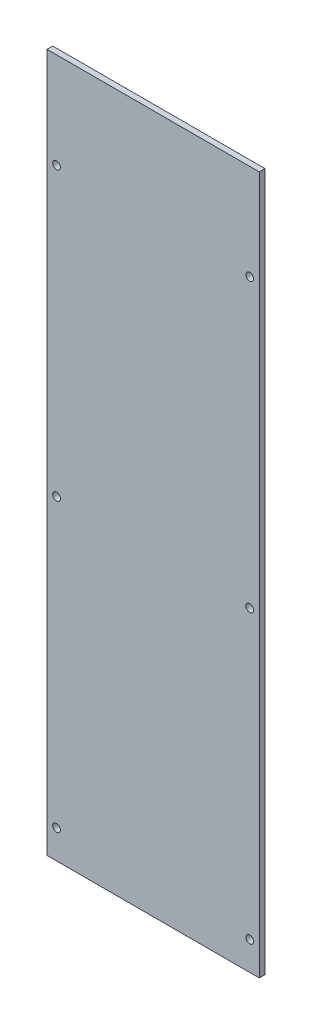
ISO-10303-21;
HEADER;
FILE_DESCRIPTION(('STEP AP214'),'2;1');
FILE_NAME('part.step','',(''),(''),'','','');
FILE_SCHEMA(('AUTOMOTIVE_DESIGN { 1 0 10303 214 1 1 1 1 }'));
ENDSEC;
DATA;
#1=APPLICATION_CONTEXT('core data for automotive mechanical design processes');
#2=APPLICATION_PROTOCOL_DEFINITION('international standard','automotive_design',2000,#1);
#3=PRODUCT_CONTEXT('',#1,'mechanical');
#4=PRODUCT('Part','Part','',(#3));
#5=PRODUCT_RELATED_PRODUCT_CATEGORY('part','',(#4));
#6=PRODUCT_DEFINITION_FORMATION('','',#4);
#7=PRODUCT_DEFINITION_CONTEXT('part definition',#1,'design');
#8=PRODUCT_DEFINITION('design','',#6,#7);
#9=PRODUCT_DEFINITION_SHAPE('','',#8);
#10=(LENGTH_UNIT() NAMED_UNIT(*) SI_UNIT(.MILLI.,.METRE.));
#11=(NAMED_UNIT(*) PLANE_ANGLE_UNIT() SI_UNIT($,.RADIAN.));
#12=(NAMED_UNIT(*) SI_UNIT($,.STERADIAN.) SOLID_ANGLE_UNIT());
#13=UNCERTAINTY_MEASURE_WITH_UNIT(LENGTH_MEASURE(1.E-05),#10,'distance_accuracy_value','');
#14=(GEOMETRIC_REPRESENTATION_CONTEXT(3) GLOBAL_UNCERTAINTY_ASSIGNED_CONTEXT((#13)) GLOBAL_UNIT_ASSIGNED_CONTEXT((#10,
#11,#12)) REPRESENTATION_CONTEXT('',''));
#15=CARTESIAN_POINT('',(0.,0.,0.));
#16=DIRECTION('',(0.,0.,1.));
#17=DIRECTION('',(1.,0.,0.));
#18=AXIS2_PLACEMENT_3D('',#15,#16,#17);
#19=CARTESIAN_POINT('',(0.,0.,3.));
#20=DIRECTION('',(0.,0.,-1.));
#21=DIRECTION('',(-1.,0.,0.));
#22=AXIS2_PLACEMENT_3D('',#19,#20,#21);
#23=PLANE('',#22);
#24=DIRECTION('',(0.,-1.,0.));
#25=VECTOR('',#24,1.);
#26=CARTESIAN_POINT('',(-55.5000000000054,184.999999999954,3.));
#27=LINE('',#26,#25);
#28=CARTESIAN_POINT('',(-55.5000000000054,184.999999999954,3.));
#29=VERTEX_POINT('',#28);
#30=CARTESIAN_POINT('',(-55.5000000000054,-180.000000000001,3.));
#31=VERTEX_POINT('',#30);
#32=EDGE_CURVE('E84',#29,#31,#27,.T.);
#33=ORIENTED_EDGE('',*,*,#32,.T.);
#34=DIRECTION('',(1.,0.,0.));
#35=VECTOR('',#34,1.);
#36=CARTESIAN_POINT('',(55.5000000000054,-180.000000000001,3.));
#37=LINE('',#36,#35);
#38=CARTESIAN_POINT('',(55.5000000000054,-180.000000000001,3.));
#39=VERTEX_POINT('',#38);
#40=EDGE_CURVE('E79',#31,#39,#37,.T.);
#41=ORIENTED_EDGE('',*,*,#40,.T.);
#42=DIRECTION('',(0.,1.,0.));
#43=VECTOR('',#42,1.);
#44=CARTESIAN_POINT('',(55.5000000000054,-180.000000000001,3.));
#45=LINE('',#44,#43);
#46=CARTESIAN_POINT('',(55.5000000000054,184.999999999954,3.));
#47=VERTEX_POINT('',#46);
#48=EDGE_CURVE('E82',#39,#47,#45,.T.);
#49=ORIENTED_EDGE('',*,*,#48,.T.);
#50=DIRECTION('',(-1.,0.,0.));
#51=VECTOR('',#50,1.);
#52=CARTESIAN_POINT('',(-55.5000000000054,184.999999999954,3.));
#53=LINE('',#52,#51);
#54=EDGE_CURVE('E49',#47,#29,#53,.T.);
#55=ORIENTED_EDGE('',*,*,#54,.T.);
#56=EDGE_LOOP('',(#33,#41,#49,#55));
#57=FACE_BOUND('',#56,.T.);
#58=CARTESIAN_POINT('',(50.5000000000054,-15.0000000000464,3.));
#59=DIRECTION('',(0.,0.,1.));
#60=DIRECTION('',(1.,0.,0.));
#61=AXIS2_PLACEMENT_3D('',#58,#59,#60);
#62=CIRCLE('',#61,1.99999999999214);
#63=CARTESIAN_POINT('',(52.4999999999976,-15.0000000000464,3.));
#64=VERTEX_POINT('',#63);
#65=EDGE_CURVE('E99',#64,#64,#62,.T.);
#66=ORIENTED_EDGE('',*,*,#65,.F.);
#67=EDGE_LOOP('',(#66));
#68=FACE_BOUND('',#67,.T.);
#69=CARTESIAN_POINT('',(-50.5000000000028,-15.0000000000482,3.));
#70=DIRECTION('',(0.,0.,1.));
#71=DIRECTION('',(1.,0.,0.));
#72=AXIS2_PLACEMENT_3D('',#69,#70,#71);
#73=CIRCLE('',#72,2.);
#74=CARTESIAN_POINT('',(-48.5000000000028,-15.0000000000482,3.));
#75=VERTEX_POINT('',#74);
#76=EDGE_CURVE('E114',#75,#75,#73,.T.);
#77=ORIENTED_EDGE('',*,*,#76,.F.);
#78=EDGE_LOOP('',(#77));
#79=FACE_BOUND('',#78,.T.);
#80=CARTESIAN_POINT('',(-50.5000000000054,-165.000000000046,3.));
#81=DIRECTION('',(0.,0.,1.));
#82=DIRECTION('',(1.,0.,0.));
#83=AXIS2_PLACEMENT_3D('',#80,#81,#82);
#84=CIRCLE('',#83,2.00000000000442);
#85=CARTESIAN_POINT('',(-48.500000000001,-165.000000000046,3.));
#86=VERTEX_POINT('',#85);
#87=EDGE_CURVE('E120',#86,#86,#84,.T.);
#88=ORIENTED_EDGE('',*,*,#87,.F.);
#89=EDGE_LOOP('',(#88));
#90=FACE_BOUND('',#89,.T.);
#91=CARTESIAN_POINT('',(50.5000000000054,-165.000000000046,3.));
#92=DIRECTION('',(0.,0.,1.));
#93=DIRECTION('',(1.,0.,0.));
#94=AXIS2_PLACEMENT_3D('',#91,#92,#93);
#95=CIRCLE('',#94,1.99999999999466);
#96=CARTESIAN_POINT('',(52.5000000000001,-165.000000000046,3.));
#97=VERTEX_POINT('',#96);
#98=EDGE_CURVE('E126',#97,#97,#95,.T.);
#99=ORIENTED_EDGE('',*,*,#98,.F.);
#100=EDGE_LOOP('',(#99));
#101=FACE_BOUND('',#100,.T.);
#102=CARTESIAN_POINT('',(50.5000000000054,134.999999999954,3.));
#103=DIRECTION('',(0.,0.,1.));
#104=DIRECTION('',(1.,0.,0.));
#105=AXIS2_PLACEMENT_3D('',#102,#103,#104);
#106=CIRCLE('',#105,1.99999999998964);
#107=CARTESIAN_POINT('',(52.4999999999951,134.999999999954,3.));
#108=VERTEX_POINT('',#107);
#109=EDGE_CURVE('E132',#108,#108,#106,.T.);
#110=ORIENTED_EDGE('',*,*,#109,.F.);
#111=EDGE_LOOP('',(#110));
#112=FACE_BOUND('',#111,.T.);
#113=CARTESIAN_POINT('',(-50.5000000000054,134.999999999952,3.));
#114=DIRECTION('',(0.,0.,1.));
#115=DIRECTION('',(1.,0.,0.));
#116=AXIS2_PLACEMENT_3D('',#113,#114,#115);
#117=CIRCLE('',#116,2.);
#118=CARTESIAN_POINT('',(-48.5000000000054,134.999999999952,3.));
#119=VERTEX_POINT('',#118);
#120=EDGE_CURVE('E138',#119,#119,#117,.T.);
#121=ORIENTED_EDGE('',*,*,#120,.F.);
#122=EDGE_LOOP('',(#121));
#123=FACE_BOUND('',#122,.T.);
#124=ADVANCED_FACE('F32',(#57,#68,#79,#90,#101,#112,#123),#23,.F.);
#125=CARTESIAN_POINT('',(0.,0.,0.));
#126=DIRECTION('',(0.,0.,-1.));
#127=DIRECTION('',(-1.,0.,0.));
#128=AXIS2_PLACEMENT_3D('',#125,#126,#127);
#129=PLANE('',#128);
#130=CARTESIAN_POINT('',(50.5000000000054,134.999999999954,0.));
#131=DIRECTION('',(0.,0.,1.));
#132=DIRECTION('',(1.,0.,0.));
#133=AXIS2_PLACEMENT_3D('',#130,#131,#132);
#134=CIRCLE('',#133,1.99999999998964);
#135=CARTESIAN_POINT('',(52.4999999999951,134.999999999954,0.));
#136=VERTEX_POINT('',#135);
#137=EDGE_CURVE('E135',#136,#136,#134,.T.);
#138=ORIENTED_EDGE('',*,*,#137,.T.);
#139=EDGE_LOOP('',(#138));
#140=FACE_BOUND('',#139,.T.);
#141=CARTESIAN_POINT('',(-50.5000000000054,-165.000000000046,0.));
#142=DIRECTION('',(0.,0.,1.));
#143=DIRECTION('',(1.,0.,0.));
#144=AXIS2_PLACEMENT_3D('',#141,#142,#143);
#145=CIRCLE('',#144,2.00000000000442);
#146=CARTESIAN_POINT('',(-48.500000000001,-165.000000000046,0.));
#147=VERTEX_POINT('',#146);
#148=EDGE_CURVE('E123',#147,#147,#145,.T.);
#149=ORIENTED_EDGE('',*,*,#148,.T.);
#150=EDGE_LOOP('',(#149));
#151=FACE_BOUND('',#150,.T.);
#152=CARTESIAN_POINT('',(50.5000000000054,-15.0000000000464,0.));
#153=DIRECTION('',(0.,0.,1.));
#154=DIRECTION('',(1.,0.,0.));
#155=AXIS2_PLACEMENT_3D('',#152,#153,#154);
#156=CIRCLE('',#155,1.99999999999214);
#157=CARTESIAN_POINT('',(52.4999999999976,-15.0000000000464,0.));
#158=VERTEX_POINT('',#157);
#159=EDGE_CURVE('E111',#158,#158,#156,.T.);
#160=ORIENTED_EDGE('',*,*,#159,.T.);
#161=EDGE_LOOP('',(#160));
#162=FACE_BOUND('',#161,.T.);
#163=DIRECTION('',(0.,-1.,0.));
#164=VECTOR('',#163,1.);
#165=CARTESIAN_POINT('',(-55.5000000000054,184.999999999954,0.));
#166=LINE('',#165,#164);
#167=CARTESIAN_POINT('',(-55.5000000000054,184.999999999954,0.));
#168=VERTEX_POINT('',#167);
#169=CARTESIAN_POINT('',(-55.5000000000054,-180.000000000001,0.));
#170=VERTEX_POINT('',#169);
#171=EDGE_CURVE('E96',#168,#170,#166,.T.);
#172=ORIENTED_EDGE('',*,*,#171,.F.);
#173=DIRECTION('',(-1.,0.,0.));
#174=VECTOR('',#173,1.);
#175=CARTESIAN_POINT('',(-55.5000000000054,184.999999999954,0.));
#176=LINE('',#175,#174);
#177=CARTESIAN_POINT('',(55.5000000000054,184.999999999954,0.));
#178=VERTEX_POINT('',#177);
#179=EDGE_CURVE('E72',#178,#168,#176,.T.);
#180=ORIENTED_EDGE('',*,*,#179,.F.);
#181=DIRECTION('',(0.,1.,0.));
#182=VECTOR('',#181,1.);
#183=CARTESIAN_POINT('',(55.5000000000054,-180.000000000001,0.));
#184=LINE('',#183,#182);
#185=CARTESIAN_POINT('',(55.5000000000054,-180.000000000001,0.));
#186=VERTEX_POINT('',#185);
#187=EDGE_CURVE('E66',#186,#178,#184,.T.);
#188=ORIENTED_EDGE('',*,*,#187,.F.);
#189=DIRECTION('',(1.,0.,0.));
#190=VECTOR('',#189,1.);
#191=CARTESIAN_POINT('',(55.5000000000054,-180.000000000001,0.));
#192=LINE('',#191,#190);
#193=EDGE_CURVE('E88',#170,#186,#192,.T.);
#194=ORIENTED_EDGE('',*,*,#193,.F.);
#195=EDGE_LOOP('',(#172,#180,#188,#194));
#196=FACE_BOUND('',#195,.T.);
#197=CARTESIAN_POINT('',(-50.5000000000028,-15.0000000000482,0.));
#198=DIRECTION('',(0.,0.,1.));
#199=DIRECTION('',(1.,0.,0.));
#200=AXIS2_PLACEMENT_3D('',#197,#198,#199);
#201=CIRCLE('',#200,2.);
#202=CARTESIAN_POINT('',(-48.5000000000028,-15.0000000000482,0.));
#203=VERTEX_POINT('',#202);
#204=EDGE_CURVE('E117',#203,#203,#201,.T.);
#205=ORIENTED_EDGE('',*,*,#204,.T.);
#206=EDGE_LOOP('',(#205));
#207=FACE_BOUND('',#206,.T.);
#208=CARTESIAN_POINT('',(50.5000000000054,-165.000000000046,0.));
#209=DIRECTION('',(0.,0.,1.));
#210=DIRECTION('',(1.,0.,0.));
#211=AXIS2_PLACEMENT_3D('',#208,#209,#210);
#212=CIRCLE('',#211,1.99999999999466);
#213=CARTESIAN_POINT('',(52.5000000000001,-165.000000000046,0.));
#214=VERTEX_POINT('',#213);
#215=EDGE_CURVE('E129',#214,#214,#212,.T.);
#216=ORIENTED_EDGE('',*,*,#215,.T.);
#217=EDGE_LOOP('',(#216));
#218=FACE_BOUND('',#217,.T.);
#219=CARTESIAN_POINT('',(-50.5000000000054,134.999999999952,0.));
#220=DIRECTION('',(0.,0.,1.));
#221=DIRECTION('',(1.,0.,0.));
#222=AXIS2_PLACEMENT_3D('',#219,#220,#221);
#223=CIRCLE('',#222,2.);
#224=CARTESIAN_POINT('',(-48.5000000000054,134.999999999952,0.));
#225=VERTEX_POINT('',#224);
#226=EDGE_CURVE('E141',#225,#225,#223,.T.);
#227=ORIENTED_EDGE('',*,*,#226,.T.);
#228=EDGE_LOOP('',(#227));
#229=FACE_BOUND('',#228,.T.);
#230=ADVANCED_FACE('F107',(#140,#151,#162,#196,#207,#218,#229),#129,.T.);
#231=CARTESIAN_POINT('',(-55.5000000000054,184.999999999954,3.));
#232=DIRECTION('',(1.,0.,0.));
#233=DIRECTION('',(0.,1.,0.));
#234=AXIS2_PLACEMENT_3D('',#231,#232,#233);
#235=PLANE('',#234);
#236=ORIENTED_EDGE('',*,*,#171,.T.);
#237=DIRECTION('',(0.,0.,-1.));
#238=VECTOR('',#237,1.);
#239=CARTESIAN_POINT('',(-55.5000000000054,-180.000000000001,3.));
#240=LINE('',#239,#238);
#241=EDGE_CURVE('E11',#31,#170,#240,.T.);
#242=ORIENTED_EDGE('',*,*,#241,.F.);
#243=ORIENTED_EDGE('',*,*,#32,.F.);
#244=DIRECTION('',(0.,0.,-1.));
#245=VECTOR('',#244,1.);
#246=CARTESIAN_POINT('',(-55.5000000000054,184.999999999954,3.));
#247=LINE('',#246,#245);
#248=EDGE_CURVE('E92',#29,#168,#247,.T.);
#249=ORIENTED_EDGE('',*,*,#248,.T.);
#250=EDGE_LOOP('',(#236,#242,#243,#249));
#251=FACE_BOUND('',#250,.T.);
#252=ADVANCED_FACE('F34',(#251),#235,.F.);
#253=CARTESIAN_POINT('',(55.5000000000054,-180.000000000001,3.));
#254=DIRECTION('',(0.,1.,0.));
#255=DIRECTION('',(0.,0.,1.));
#256=AXIS2_PLACEMENT_3D('',#253,#254,#255);
#257=PLANE('',#256);
#258=ORIENTED_EDGE('',*,*,#193,.T.);
#259=DIRECTION('',(0.,0.,-1.));
#260=VECTOR('',#259,1.);
#261=CARTESIAN_POINT('',(55.5000000000054,-180.000000000001,3.));
#262=LINE('',#261,#260);
#263=EDGE_CURVE('E41',#39,#186,#262,.T.);
#264=ORIENTED_EDGE('',*,*,#263,.F.);
#265=ORIENTED_EDGE('',*,*,#40,.F.);
#266=ORIENTED_EDGE('',*,*,#241,.T.);
#267=EDGE_LOOP('',(#258,#264,#265,#266));
#268=FACE_BOUND('',#267,.T.);
#269=ADVANCED_FACE('F87',(#268),#257,.F.);
#270=CARTESIAN_POINT('',(55.5000000000054,-180.000000000001,3.));
#271=DIRECTION('',(-1.,0.,0.));
#272=DIRECTION('',(0.,-1.,0.));
#273=AXIS2_PLACEMENT_3D('',#270,#271,#272);
#274=PLANE('',#273);
#275=ORIENTED_EDGE('',*,*,#187,.T.);
#276=DIRECTION('',(0.,0.,-1.));
#277=VECTOR('',#276,1.);
#278=CARTESIAN_POINT('',(55.5000000000054,184.999999999954,3.));
#279=LINE('',#278,#277);
#280=EDGE_CURVE('E89',#47,#178,#279,.T.);
#281=ORIENTED_EDGE('',*,*,#280,.F.);
#282=ORIENTED_EDGE('',*,*,#48,.F.);
#283=ORIENTED_EDGE('',*,*,#263,.T.);
#284=EDGE_LOOP('',(#275,#281,#282,#283));
#285=FACE_BOUND('',#284,.T.);
#286=ADVANCED_FACE('F90',(#285),#274,.F.);
#287=CARTESIAN_POINT('',(-55.5000000000054,184.999999999954,3.));
#288=DIRECTION('',(0.,-1.,0.));
#289=DIRECTION('',(0.,0.,-1.));
#290=AXIS2_PLACEMENT_3D('',#287,#288,#289);
#291=PLANE('',#290);
#292=ORIENTED_EDGE('',*,*,#179,.T.);
#293=ORIENTED_EDGE('',*,*,#248,.F.);
#294=ORIENTED_EDGE('',*,*,#54,.F.);
#295=ORIENTED_EDGE('',*,*,#280,.T.);
#296=EDGE_LOOP('',(#292,#293,#294,#295));
#297=FACE_BOUND('',#296,.T.);
#298=ADVANCED_FACE('F104',(#297),#291,.F.);
#299=CARTESIAN_POINT('',(50.5000000000054,-15.0000000000464,3.));
#300=DIRECTION('',(0.,0.,-1.));
#301=DIRECTION('',(-1.,0.,0.));
#302=AXIS2_PLACEMENT_3D('',#299,#300,#301);
#303=CYLINDRICAL_SURFACE('',#302,1.99999999999214);
#304=ORIENTED_EDGE('',*,*,#65,.T.);
#305=EDGE_LOOP('',(#304));
#306=FACE_BOUND('',#305,.T.);
#307=ORIENTED_EDGE('',*,*,#159,.F.);
#308=EDGE_LOOP('',(#307));
#309=FACE_BOUND('',#308,.T.);
#310=ADVANCED_FACE('F158',(#306,#309),#303,.F.);
#311=CARTESIAN_POINT('',(-50.5000000000028,-15.0000000000482,3.));
#312=DIRECTION('',(0.,0.,-1.));
#313=DIRECTION('',(-1.,0.,0.));
#314=AXIS2_PLACEMENT_3D('',#311,#312,#313);
#315=CYLINDRICAL_SURFACE('',#314,2.);
#316=ORIENTED_EDGE('',*,*,#76,.T.);
#317=EDGE_LOOP('',(#316));
#318=FACE_BOUND('',#317,.T.);
#319=ORIENTED_EDGE('',*,*,#204,.F.);
#320=EDGE_LOOP('',(#319));
#321=FACE_BOUND('',#320,.T.);
#322=ADVANCED_FACE('F204',(#318,#321),#315,.F.);
#323=CARTESIAN_POINT('',(-50.5000000000054,-165.000000000046,3.));
#324=DIRECTION('',(0.,0.,-1.));
#325=DIRECTION('',(-1.,0.,0.));
#326=AXIS2_PLACEMENT_3D('',#323,#324,#325);
#327=CYLINDRICAL_SURFACE('',#326,2.00000000000442);
#328=ORIENTED_EDGE('',*,*,#87,.T.);
#329=EDGE_LOOP('',(#328));
#330=FACE_BOUND('',#329,.T.);
#331=ORIENTED_EDGE('',*,*,#148,.F.);
#332=EDGE_LOOP('',(#331));
#333=FACE_BOUND('',#332,.T.);
#334=ADVANCED_FACE('F212',(#330,#333),#327,.F.);
#335=CARTESIAN_POINT('',(50.5000000000054,-165.000000000046,3.));
#336=DIRECTION('',(0.,0.,-1.));
#337=DIRECTION('',(-1.,0.,0.));
#338=AXIS2_PLACEMENT_3D('',#335,#336,#337);
#339=CYLINDRICAL_SURFACE('',#338,1.99999999999466);
#340=ORIENTED_EDGE('',*,*,#98,.T.);
#341=EDGE_LOOP('',(#340));
#342=FACE_BOUND('',#341,.T.);
#343=ORIENTED_EDGE('',*,*,#215,.F.);
#344=EDGE_LOOP('',(#343));
#345=FACE_BOUND('',#344,.T.);
#346=ADVANCED_FACE('F220',(#342,#345),#339,.F.);
#347=CARTESIAN_POINT('',(50.5000000000054,134.999999999954,3.));
#348=DIRECTION('',(0.,0.,-1.));
#349=DIRECTION('',(-1.,0.,0.));
#350=AXIS2_PLACEMENT_3D('',#347,#348,#349);
#351=CYLINDRICAL_SURFACE('',#350,1.99999999998964);
#352=ORIENTED_EDGE('',*,*,#109,.T.);
#353=EDGE_LOOP('',(#352));
#354=FACE_BOUND('',#353,.T.);
#355=ORIENTED_EDGE('',*,*,#137,.F.);
#356=EDGE_LOOP('',(#355));
#357=FACE_BOUND('',#356,.T.);
#358=ADVANCED_FACE('F229',(#354,#357),#351,.F.);
#359=CARTESIAN_POINT('',(-50.5000000000054,134.999999999952,3.));
#360=DIRECTION('',(0.,0.,-1.));
#361=DIRECTION('',(-1.,0.,0.));
#362=AXIS2_PLACEMENT_3D('',#359,#360,#361);
#363=CYLINDRICAL_SURFACE('',#362,2.);
#364=ORIENTED_EDGE('',*,*,#120,.T.);
#365=EDGE_LOOP('',(#364));
#366=FACE_BOUND('',#365,.T.);
#367=ORIENTED_EDGE('',*,*,#226,.F.);
#368=EDGE_LOOP('',(#367));
#369=FACE_BOUND('',#368,.T.);
#370=ADVANCED_FACE('F147',(#366,#369),#363,.F.);
#371=CLOSED_SHELL('',(#124,#230,#252,#269,#286,#298,#310,#322,#334,#346,#358,#370));
#372=MANIFOLD_SOLID_BREP('B2',#371);
#373=ADVANCED_BREP_SHAPE_REPRESENTATION('',(#18,#372),#14);
#374=SHAPE_DEFINITION_REPRESENTATION(#9,#373);
ENDSEC;
END-ISO-10303-21;
